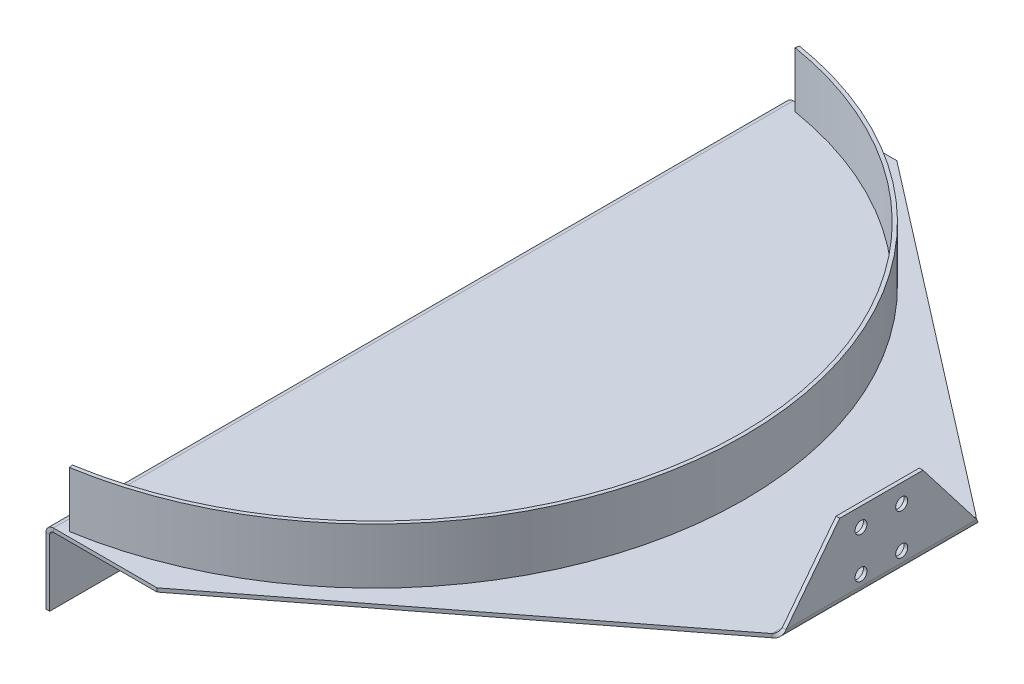
ISO-10303-21;
HEADER;
FILE_DESCRIPTION(('STEP AP214'),'2;1');
FILE_NAME('part.step','',(''),(''),'','','');
FILE_SCHEMA(('AUTOMOTIVE_DESIGN { 1 0 10303 214 1 1 1 1 }'));
ENDSEC;
DATA;
#1=APPLICATION_CONTEXT('core data for automotive mechanical design processes');
#2=APPLICATION_PROTOCOL_DEFINITION('international standard','automotive_design',2000,#1);
#3=PRODUCT_CONTEXT('',#1,'mechanical');
#4=PRODUCT('Part','Part','',(#3));
#5=PRODUCT_RELATED_PRODUCT_CATEGORY('part','',(#4));
#6=PRODUCT_DEFINITION_FORMATION('','',#4);
#7=PRODUCT_DEFINITION_CONTEXT('part definition',#1,'design');
#8=PRODUCT_DEFINITION('design','',#6,#7);
#9=PRODUCT_DEFINITION_SHAPE('','',#8);
#10=(LENGTH_UNIT() NAMED_UNIT(*) SI_UNIT(.MILLI.,.METRE.));
#11=(NAMED_UNIT(*) PLANE_ANGLE_UNIT() SI_UNIT($,.RADIAN.));
#12=(NAMED_UNIT(*) SI_UNIT($,.STERADIAN.) SOLID_ANGLE_UNIT());
#13=UNCERTAINTY_MEASURE_WITH_UNIT(LENGTH_MEASURE(1.E-05),#10,'distance_accuracy_value','');
#14=(GEOMETRIC_REPRESENTATION_CONTEXT(3) GLOBAL_UNCERTAINTY_ASSIGNED_CONTEXT((#13)) GLOBAL_UNIT_ASSIGNED_CONTEXT((#10,
#11,#12)) REPRESENTATION_CONTEXT('',''));
#15=CARTESIAN_POINT('',(0.,0.,0.));
#16=DIRECTION('',(0.,0.,1.));
#17=DIRECTION('',(1.,0.,0.));
#18=AXIS2_PLACEMENT_3D('',#15,#16,#17);
#19=CARTESIAN_POINT('',(0.,0.,200.));
#20=DIRECTION('',(0.,1.,0.));
#21=DIRECTION('',(0.,0.,1.));
#22=AXIS2_PLACEMENT_3D('',#19,#20,#21);
#23=PLANE('',#22);
#24=DIRECTION('',(0.,0.,1.));
#25=VECTOR('',#24,1.);
#26=CARTESIAN_POINT('',(247.643805509807,0.,200.));
#27=LINE('',#26,#25);
#28=CARTESIAN_POINT('',(247.643805509807,0.,-55.1879327043874));
#29=VERTEX_POINT('',#28);
#30=CARTESIAN_POINT('',(247.643805509807,0.,55.1879327043878));
#31=VERTEX_POINT('',#30);
#32=EDGE_CURVE('E415',#29,#31,#27,.T.);
#33=ORIENTED_EDGE('',*,*,#32,.F.);
#34=DIRECTION('',(0.791663337808105,0.,0.610957575917125));
#35=VECTOR('',#34,1.);
#36=CARTESIAN_POINT('',(60.,0.,-200.));
#37=LINE('',#36,#35);
#38=CARTESIAN_POINT('',(60.,0.,-200.));
#39=VERTEX_POINT('',#38);
#40=EDGE_CURVE('E369',#39,#29,#37,.T.);
#41=ORIENTED_EDGE('',*,*,#40,.F.);
#42=DIRECTION('',(1.,0.,0.));
#43=VECTOR('',#42,1.);
#44=CARTESIAN_POINT('',(0.,0.,-200.));
#45=LINE('',#44,#43);
#46=CARTESIAN_POINT('',(4.,0.,-200.));
#47=VERTEX_POINT('',#46);
#48=EDGE_CURVE('E365',#47,#39,#45,.T.);
#49=ORIENTED_EDGE('',*,*,#48,.F.);
#50=DIRECTION('',(0.,0.,-1.));
#51=VECTOR('',#50,1.);
#52=CARTESIAN_POINT('',(4.,0.,-200.));
#53=LINE('',#52,#51);
#54=CARTESIAN_POINT('',(4.,0.,200.));
#55=VERTEX_POINT('',#54);
#56=EDGE_CURVE('E368',#55,#47,#53,.T.);
#57=ORIENTED_EDGE('',*,*,#56,.F.);
#58=DIRECTION('',(-1.,0.,0.));
#59=VECTOR('',#58,1.);
#60=CARTESIAN_POINT('',(0.,0.,200.));
#61=LINE('',#60,#59);
#62=CARTESIAN_POINT('',(59.9999999999999,0.,200.));
#63=VERTEX_POINT('',#62);
#64=EDGE_CURVE('E394',#63,#55,#61,.T.);
#65=ORIENTED_EDGE('',*,*,#64,.F.);
#66=DIRECTION('',(-0.791663337808105,0.,0.610957575917125));
#67=VECTOR('',#66,1.);
#68=CARTESIAN_POINT('',(59.9999999999999,0.,200.));
#69=LINE('',#68,#67);
#70=EDGE_CURVE('E364',#31,#63,#69,.T.);
#71=ORIENTED_EDGE('',*,*,#70,.F.);
#72=EDGE_LOOP('',(#33,#41,#49,#57,#65,#71));
#73=FACE_BOUND('',#72,.T.);
#74=DIRECTION('',(-0.162499999999995,0.,-0.986708543593295));
#75=VECTOR('',#74,1.);
#76=CARTESIAN_POINT('',(9.99999999999998,0.,197.341708718659));
#77=LINE('',#76,#75);
#78=CARTESIAN_POINT('',(9.99999999999998,0.,197.341708718659));
#79=VERTEX_POINT('',#78);
#80=CARTESIAN_POINT('',(9.67499999999999,0.,195.368291631472));
#81=VERTEX_POINT('',#80);
#82=EDGE_CURVE('E51',#79,#81,#77,.T.);
#83=ORIENTED_EDGE('',*,*,#82,.T.);
#84=CARTESIAN_POINT('',(-22.5,0.,0.));
#85=DIRECTION('',(0.,1.,0.));
#86=DIRECTION('',(-1.,0.,0.));
#87=AXIS2_PLACEMENT_3D('',#84,#85,#86);
#88=CIRCLE('',#87,198.);
#89=CARTESIAN_POINT('',(9.67500000000008,0.,-195.368291631472));
#90=VERTEX_POINT('',#89);
#91=EDGE_CURVE('E158',#90,#81,#88,.F.);
#92=ORIENTED_EDGE('',*,*,#91,.F.);
#93=DIRECTION('',(0.162499999999955,0.,-0.986708543593302));
#94=VECTOR('',#93,1.);
#95=CARTESIAN_POINT('',(9.67500000000008,0.,-195.368291631472));
#96=LINE('',#95,#94);
#97=CARTESIAN_POINT('',(9.99999999999999,0.,-197.341708718659));
#98=VERTEX_POINT('',#97);
#99=EDGE_CURVE('E161',#90,#98,#96,.T.);
#100=ORIENTED_EDGE('',*,*,#99,.T.);
#101=CARTESIAN_POINT('',(-22.5,0.,0.));
#102=DIRECTION('',(0.,-1.,0.));
#103=DIRECTION('',(0.,0.,-1.));
#104=AXIS2_PLACEMENT_3D('',#101,#102,#103);
#105=CIRCLE('',#104,200.);
#106=EDGE_CURVE('E56',#98,#79,#105,.T.);
#107=ORIENTED_EDGE('',*,*,#106,.T.);
#108=EDGE_LOOP('',(#83,#92,#100,#107));
#109=FACE_BOUND('',#108,.T.);
#110=ADVANCED_FACE('F33',(#73,#109),#23,.T.);
#111=CARTESIAN_POINT('',(249.643805509808,-250.356194490192,200.));
#112=DIRECTION('',(-1.,0.,0.));
#113=DIRECTION('',(0.,0.,1.));
#114=AXIS2_PLACEMENT_3D('',#111,#112,#113);
#115=PLANE('',#114);
#116=CARTESIAN_POINT('',(249.643805509807,7.64380550980766,-11.0000000000002));
#117=DIRECTION('',(-1.,0.,0.));
#118=DIRECTION('',(0.,-1.,0.));
#119=AXIS2_PLACEMENT_3D('',#116,#117,#118);
#120=CIRCLE('',#119,3.25);
#121=CARTESIAN_POINT('',(249.643805509807,4.39380550980766,-11.0000000000002));
#122=VERTEX_POINT('',#121);
#123=EDGE_CURVE('E769',#122,#122,#120,.F.);
#124=ORIENTED_EDGE('',*,*,#123,.T.);
#125=EDGE_LOOP('',(#124));
#126=FACE_BOUND('',#125,.T.);
#127=CARTESIAN_POINT('',(249.643805509807,7.64380550980766,10.9999999999998));
#128=DIRECTION('',(-1.,0.,0.));
#129=DIRECTION('',(0.,-1.,0.));
#130=AXIS2_PLACEMENT_3D('',#127,#128,#129);
#131=CIRCLE('',#130,3.25);
#132=CARTESIAN_POINT('',(249.643805509807,4.39380550980766,10.9999999999998));
#133=VERTEX_POINT('',#132);
#134=EDGE_CURVE('E777',#133,#133,#131,.F.);
#135=ORIENTED_EDGE('',*,*,#134,.T.);
#136=EDGE_LOOP('',(#135));
#137=FACE_BOUND('',#136,.T.);
#138=CARTESIAN_POINT('',(249.643805509807,29.6438055098077,-11.));
#139=DIRECTION('',(-1.,0.,0.));
#140=DIRECTION('',(0.,-1.,0.));
#141=AXIS2_PLACEMENT_3D('',#138,#139,#140);
#142=CIRCLE('',#141,3.25);
#143=CARTESIAN_POINT('',(249.643805509807,26.3938055098077,-11.));
#144=VERTEX_POINT('',#143);
#145=EDGE_CURVE('E783',#144,#144,#142,.F.);
#146=ORIENTED_EDGE('',*,*,#145,.T.);
#147=EDGE_LOOP('',(#146));
#148=FACE_BOUND('',#147,.T.);
#149=CARTESIAN_POINT('',(249.643805509807,29.6438055098077,11.));
#150=DIRECTION('',(-1.,0.,0.));
#151=DIRECTION('',(0.,-1.,0.));
#152=AXIS2_PLACEMENT_3D('',#149,#150,#151);
#153=CIRCLE('',#152,3.25);
#154=CARTESIAN_POINT('',(249.643805509807,26.3938055098077,11.));
#155=VERTEX_POINT('',#154);
#156=EDGE_CURVE('E789',#155,#155,#153,.F.);
#157=ORIENTED_EDGE('',*,*,#156,.T.);
#158=EDGE_LOOP('',(#157));
#159=FACE_BOUND('',#158,.T.);
#160=DIRECTION('',(0.,0.791663337808105,0.610957575917125));
#161=VECTOR('',#160,1.);
#162=CARTESIAN_POINT('',(249.643805509808,-190.356194490192,-200.));
#163=LINE('',#162,#161);
#164=CARTESIAN_POINT('',(249.643805509807,2.00000000000006,-51.5511977303952));
#165=VERTEX_POINT('',#164);
#166=CARTESIAN_POINT('',(249.643805509807,39.6438055098079,-22.5));
#167=VERTEX_POINT('',#166);
#168=EDGE_CURVE('E480',#165,#167,#163,.T.);
#169=ORIENTED_EDGE('',*,*,#168,.F.);
#170=DIRECTION('',(0.,0.,1.));
#171=VECTOR('',#170,1.);
#172=CARTESIAN_POINT('',(249.643805509807,1.99999999999995,200.));
#173=LINE('',#172,#171);
#174=CARTESIAN_POINT('',(249.643805509807,2.00000000000001,51.5511977303954));
#175=VERTEX_POINT('',#174);
#176=EDGE_CURVE('E11',#165,#175,#173,.T.);
#177=ORIENTED_EDGE('',*,*,#176,.T.);
#178=DIRECTION('',(0.,-0.791663337808105,0.610957575917125));
#179=VECTOR('',#178,1.);
#180=CARTESIAN_POINT('',(249.643805509808,-190.356194490192,200.));
#181=LINE('',#180,#179);
#182=CARTESIAN_POINT('',(249.643805509807,39.6438055098077,22.5));
#183=VERTEX_POINT('',#182);
#184=EDGE_CURVE('E491',#183,#175,#181,.T.);
#185=ORIENTED_EDGE('',*,*,#184,.F.);
#186=DIRECTION('',(0.,0.,-1.));
#187=VECTOR('',#186,1.);
#188=CARTESIAN_POINT('',(249.643805509807,39.6438055098079,200.));
#189=LINE('',#188,#187);
#190=EDGE_CURVE('E486',#183,#167,#189,.T.);
#191=ORIENTED_EDGE('',*,*,#190,.T.);
#192=EDGE_LOOP('',(#169,#177,#185,#191));
#193=FACE_BOUND('',#192,.T.);
#194=ADVANCED_FACE('F437',(#126,#137,#148,#159,#193),#115,.T.);
#195=CARTESIAN_POINT('',(1235.09893920936,-190.356194490189,-200.));
#196=DIRECTION('',(0.,-0.610957575917125,0.791663337808105));
#197=DIRECTION('',(0.,-0.791663337808106,-0.610957575917125));
#198=AXIS2_PLACEMENT_3D('',#195,#196,#197);
#199=PLANE('',#198);
#200=CARTESIAN_POINT('',(249.643805509807,2.00000000000004,-51.551197730395));
#201=CARTESIAN_POINT('',(251.643805509807,2.00000000000007,-51.5511977303951));
#202=B_SPLINE_CURVE_WITH_KNOTS('',1,(#200,#201),.UNSPECIFIED.,.F.,.F.,(2,2),(0.,1.),.UNSPECIFIED.);
#203=CARTESIAN_POINT('',(251.643805509807,2.00000000000006,-51.5511977303952));
#204=VERTEX_POINT('',#203);
#205=EDGE_CURVE('E312',#165,#204,#202,.T.);
#206=ORIENTED_EDGE('',*,*,#205,.F.);
#207=ORIENTED_EDGE('',*,*,#168,.T.);
#208=DIRECTION('',(-1.,0.,0.));
#209=VECTOR('',#208,1.);
#210=CARTESIAN_POINT('',(1235.09893920936,39.6438055098113,-22.5));
#211=LINE('',#210,#209);
#212=CARTESIAN_POINT('',(251.643805509807,39.6438055098079,-22.5));
#213=VERTEX_POINT('',#212);
#214=EDGE_CURVE('E503',#213,#167,#211,.T.);
#215=ORIENTED_EDGE('',*,*,#214,.F.);
#216=DIRECTION('',(0.,0.791663337808105,0.610957575917125));
#217=VECTOR('',#216,1.);
#218=CARTESIAN_POINT('',(251.643805509808,-190.356194490192,-200.));
#219=LINE('',#218,#217);
#220=EDGE_CURVE('E466',#204,#213,#219,.T.);
#221=ORIENTED_EDGE('',*,*,#220,.F.);
#222=EDGE_LOOP('',(#206,#207,#215,#221));
#223=FACE_BOUND('',#222,.T.);
#224=ADVANCED_FACE('F35',(#223),#199,.F.);
#225=CARTESIAN_POINT('',(1235.09893920936,39.6438055098114,200.));
#226=DIRECTION('',(0.,1.,0.));
#227=DIRECTION('',(-1.,0.,0.));
#228=AXIS2_PLACEMENT_3D('',#225,#226,#227);
#229=PLANE('',#228);
#230=ORIENTED_EDGE('',*,*,#214,.T.);
#231=ORIENTED_EDGE('',*,*,#190,.F.);
#232=DIRECTION('',(-1.,0.,0.));
#233=VECTOR('',#232,1.);
#234=CARTESIAN_POINT('',(1235.09893920936,39.6438055098111,22.5));
#235=LINE('',#234,#233);
#236=CARTESIAN_POINT('',(251.643805509807,39.6438055098077,22.5));
#237=VERTEX_POINT('',#236);
#238=EDGE_CURVE('E471',#237,#183,#235,.T.);
#239=ORIENTED_EDGE('',*,*,#238,.F.);
#240=DIRECTION('',(0.,0.,-1.));
#241=VECTOR('',#240,1.);
#242=CARTESIAN_POINT('',(251.643805509807,39.6438055098079,200.));
#243=LINE('',#242,#241);
#244=EDGE_CURVE('E467',#237,#213,#243,.T.);
#245=ORIENTED_EDGE('',*,*,#244,.T.);
#246=EDGE_LOOP('',(#230,#231,#239,#245));
#247=FACE_BOUND('',#246,.T.);
#248=ADVANCED_FACE('F447',(#247),#229,.T.);
#249=CARTESIAN_POINT('',(1235.09893920936,-190.356194490189,200.));
#250=DIRECTION('',(0.,-0.610957575917125,-0.791663337808105));
#251=DIRECTION('',(0.,0.791663337808105,-0.610957575917125));
#252=AXIS2_PLACEMENT_3D('',#249,#250,#251);
#253=PLANE('',#252);
#254=CARTESIAN_POINT('',(251.643805509807,2.,51.5511977303952));
#255=CARTESIAN_POINT('',(249.643805509807,2.00000000000001,51.5511977303953));
#256=B_SPLINE_CURVE_WITH_KNOTS('',1,(#254,#255),.UNSPECIFIED.,.F.,.F.,(2,2),(0.,1.),.UNSPECIFIED.);
#257=CARTESIAN_POINT('',(251.643805509807,2.,51.5511977303951));
#258=VERTEX_POINT('',#257);
#259=EDGE_CURVE('E299',#258,#175,#256,.T.);
#260=ORIENTED_EDGE('',*,*,#259,.F.);
#261=DIRECTION('',(0.,-0.791663337808105,0.610957575917125));
#262=VECTOR('',#261,1.);
#263=CARTESIAN_POINT('',(251.643805509808,-190.356194490192,200.));
#264=LINE('',#263,#262);
#265=EDGE_CURVE('E463',#237,#258,#264,.T.);
#266=ORIENTED_EDGE('',*,*,#265,.F.);
#267=ORIENTED_EDGE('',*,*,#238,.T.);
#268=ORIENTED_EDGE('',*,*,#184,.T.);
#269=EDGE_LOOP('',(#260,#266,#267,#268));
#270=FACE_BOUND('',#269,.T.);
#271=ADVANCED_FACE('F443',(#270),#253,.F.);
#272=CARTESIAN_POINT('',(251.643805509808,-250.356194490192,200.));
#273=DIRECTION('',(-1.,0.,0.));
#274=DIRECTION('',(0.,0.,1.));
#275=AXIS2_PLACEMENT_3D('',#272,#273,#274);
#276=PLANE('',#275);
#277=CARTESIAN_POINT('',(251.643805509807,7.64380550980767,-11.0000000000002));
#278=DIRECTION('',(1.,0.,0.));
#279=DIRECTION('',(0.,1.,0.));
#280=AXIS2_PLACEMENT_3D('',#277,#278,#279);
#281=CIRCLE('',#280,3.25);
#282=CARTESIAN_POINT('',(251.643805509807,10.8938055098077,-11.0000000000002));
#283=VERTEX_POINT('',#282);
#284=EDGE_CURVE('E774',#283,#283,#281,.T.);
#285=ORIENTED_EDGE('',*,*,#284,.F.);
#286=EDGE_LOOP('',(#285));
#287=FACE_BOUND('',#286,.T.);
#288=CARTESIAN_POINT('',(251.643805509807,7.64380550980767,10.9999999999998));
#289=DIRECTION('',(1.,0.,0.));
#290=DIRECTION('',(0.,1.,0.));
#291=AXIS2_PLACEMENT_3D('',#288,#289,#290);
#292=CIRCLE('',#291,3.25);
#293=CARTESIAN_POINT('',(251.643805509807,10.8938055098077,10.9999999999998));
#294=VERTEX_POINT('',#293);
#295=EDGE_CURVE('E780',#294,#294,#292,.T.);
#296=ORIENTED_EDGE('',*,*,#295,.F.);
#297=EDGE_LOOP('',(#296));
#298=FACE_BOUND('',#297,.T.);
#299=CARTESIAN_POINT('',(251.643805509807,29.6438055098077,-11.));
#300=DIRECTION('',(1.,0.,0.));
#301=DIRECTION('',(0.,1.,0.));
#302=AXIS2_PLACEMENT_3D('',#299,#300,#301);
#303=CIRCLE('',#302,3.25);
#304=CARTESIAN_POINT('',(251.643805509807,32.8938055098077,-11.));
#305=VERTEX_POINT('',#304);
#306=EDGE_CURVE('E786',#305,#305,#303,.T.);
#307=ORIENTED_EDGE('',*,*,#306,.F.);
#308=EDGE_LOOP('',(#307));
#309=FACE_BOUND('',#308,.T.);
#310=CARTESIAN_POINT('',(251.643805509807,29.6438055098077,11.));
#311=DIRECTION('',(1.,0.,0.));
#312=DIRECTION('',(0.,1.,0.));
#313=AXIS2_PLACEMENT_3D('',#310,#311,#312);
#314=CIRCLE('',#313,3.25);
#315=CARTESIAN_POINT('',(251.643805509807,32.8938055098077,11.));
#316=VERTEX_POINT('',#315);
#317=EDGE_CURVE('E165',#316,#316,#314,.T.);
#318=ORIENTED_EDGE('',*,*,#317,.F.);
#319=EDGE_LOOP('',(#318));
#320=FACE_BOUND('',#319,.T.);
#321=DIRECTION('',(0.,0.,1.));
#322=VECTOR('',#321,1.);
#323=CARTESIAN_POINT('',(251.643805509807,1.99999999999995,200.));
#324=LINE('',#323,#322);
#325=EDGE_CURVE('E43',#204,#258,#324,.T.);
#326=ORIENTED_EDGE('',*,*,#325,.F.);
#327=ORIENTED_EDGE('',*,*,#220,.T.);
#328=ORIENTED_EDGE('',*,*,#244,.F.);
#329=ORIENTED_EDGE('',*,*,#265,.T.);
#330=EDGE_LOOP('',(#326,#327,#328,#329));
#331=FACE_BOUND('',#330,.T.);
#332=ADVANCED_FACE('F428',(#287,#298,#309,#320,#331),#276,.F.);
#333=CARTESIAN_POINT('',(60.,-985.45513369955,-200.));
#334=DIRECTION('',(-0.610957575917125,0.,0.791663337808105));
#335=DIRECTION('',(-0.791663337808106,0.,-0.610957575917125));
#336=AXIS2_PLACEMENT_3D('',#333,#334,#335);
#337=PLANE('',#336);
#338=ORIENTED_EDGE('',*,*,#40,.T.);
#339=CARTESIAN_POINT('',(247.643805509807,-1.99999999999998,-55.1879327043877));
#340=CARTESIAN_POINT('',(247.643805509807,0.,-55.1879327043875));
#341=B_SPLINE_CURVE_WITH_KNOTS('',1,(#339,#340),.UNSPECIFIED.,.F.,.F.,(2,2),(0.,1.),.UNSPECIFIED.);
#342=CARTESIAN_POINT('',(247.643805509807,-2.,-55.1879327043878));
#343=VERTEX_POINT('',#342);
#344=EDGE_CURVE('E410',#29,#343,#341,.F.);
#345=ORIENTED_EDGE('',*,*,#344,.T.);
#346=DIRECTION('',(0.791663337808105,0.,0.610957575917125));
#347=VECTOR('',#346,1.);
#348=CARTESIAN_POINT('',(60.,-2.,-200.));
#349=LINE('',#348,#347);
#350=CARTESIAN_POINT('',(60.,-2.00000000000022,-200.));
#351=VERTEX_POINT('',#350);
#352=EDGE_CURVE('E376',#351,#343,#349,.T.);
#353=ORIENTED_EDGE('',*,*,#352,.F.);
#354=DIRECTION('',(0.,1.,0.));
#355=VECTOR('',#354,1.);
#356=CARTESIAN_POINT('',(60.,-985.45513369955,-200.));
#357=LINE('',#356,#355);
#358=EDGE_CURVE('E385',#351,#39,#357,.T.);
#359=ORIENTED_EDGE('',*,*,#358,.T.);
#360=EDGE_LOOP('',(#338,#345,#353,#359));
#361=FACE_BOUND('',#360,.T.);
#362=ADVANCED_FACE('F417',(#361),#337,.F.);
#363=CARTESIAN_POINT('',(60.,-985.45513369955,200.));
#364=DIRECTION('',(-0.610957575917125,0.,-0.791663337808105));
#365=DIRECTION('',(0.791663337808105,0.,-0.610957575917125));
#366=AXIS2_PLACEMENT_3D('',#363,#364,#365);
#367=PLANE('',#366);
#368=DIRECTION('',(-0.791663337808105,0.,0.610957575917125));
#369=VECTOR('',#368,1.);
#370=CARTESIAN_POINT('',(59.9999999999999,-2.,200.));
#371=LINE('',#370,#369);
#372=CARTESIAN_POINT('',(247.643805509807,-1.99999999999998,55.1879327043878));
#373=VERTEX_POINT('',#372);
#374=CARTESIAN_POINT('',(60.,-2.00000000000022,200.));
#375=VERTEX_POINT('',#374);
#376=EDGE_CURVE('E372',#373,#375,#371,.T.);
#377=ORIENTED_EDGE('',*,*,#376,.F.);
#378=CARTESIAN_POINT('',(247.643805509807,0.,55.1879327043878));
#379=CARTESIAN_POINT('',(247.643805509807,-1.99999999999998,55.1879327043877));
#380=B_SPLINE_CURVE_WITH_KNOTS('',1,(#378,#379),.UNSPECIFIED.,.F.,.F.,(2,2),(0.,1.),.UNSPECIFIED.);
#381=EDGE_CURVE('E399',#373,#31,#380,.F.);
#382=ORIENTED_EDGE('',*,*,#381,.T.);
#383=ORIENTED_EDGE('',*,*,#70,.T.);
#384=DIRECTION('',(0.,1.,0.));
#385=VECTOR('',#384,1.);
#386=CARTESIAN_POINT('',(60.,-985.45513369955,200.));
#387=LINE('',#386,#385);
#388=EDGE_CURVE('E382',#375,#63,#387,.T.);
#389=ORIENTED_EDGE('',*,*,#388,.F.);
#390=EDGE_LOOP('',(#377,#382,#383,#389));
#391=FACE_BOUND('',#390,.T.);
#392=ADVANCED_FACE('F427',(#391),#367,.F.);
#393=CARTESIAN_POINT('',(0.,-2.,200.));
#394=DIRECTION('',(0.,1.,0.));
#395=DIRECTION('',(0.,0.,1.));
#396=AXIS2_PLACEMENT_3D('',#393,#394,#395);
#397=PLANE('',#396);
#398=ORIENTED_EDGE('',*,*,#352,.T.);
#399=DIRECTION('',(0.,0.,1.));
#400=VECTOR('',#399,1.);
#401=CARTESIAN_POINT('',(247.643805509807,-2.,200.));
#402=LINE('',#401,#400);
#403=EDGE_CURVE('E397',#343,#373,#402,.T.);
#404=ORIENTED_EDGE('',*,*,#403,.T.);
#405=ORIENTED_EDGE('',*,*,#376,.T.);
#406=DIRECTION('',(-1.,0.,0.));
#407=VECTOR('',#406,1.);
#408=CARTESIAN_POINT('',(0.,-2.,200.));
#409=LINE('',#408,#407);
#410=CARTESIAN_POINT('',(4.,-2.,200.));
#411=VERTEX_POINT('',#410);
#412=EDGE_CURVE('E391',#375,#411,#409,.T.);
#413=ORIENTED_EDGE('',*,*,#412,.T.);
#414=DIRECTION('',(0.,0.,-1.));
#415=VECTOR('',#414,1.);
#416=CARTESIAN_POINT('',(4.,-2.,-200.));
#417=LINE('',#416,#415);
#418=CARTESIAN_POINT('',(4.,-2.,-200.));
#419=VERTEX_POINT('',#418);
#420=EDGE_CURVE('E377',#411,#419,#417,.T.);
#421=ORIENTED_EDGE('',*,*,#420,.T.);
#422=DIRECTION('',(1.,0.,0.));
#423=VECTOR('',#422,1.);
#424=CARTESIAN_POINT('',(0.,-2.,-200.));
#425=LINE('',#424,#423);
#426=EDGE_CURVE('E373',#419,#351,#425,.T.);
#427=ORIENTED_EDGE('',*,*,#426,.T.);
#428=EDGE_LOOP('',(#398,#404,#405,#413,#421,#427));
#429=FACE_BOUND('',#428,.T.);
#430=ADVANCED_FACE('F435',(#429),#397,.F.);
#431=CARTESIAN_POINT('',(0.,-985.45513369955,-200.));
#432=DIRECTION('',(0.,0.,1.));
#433=DIRECTION('',(0.,-1.,0.));
#434=AXIS2_PLACEMENT_3D('',#431,#432,#433);
#435=PLANE('',#434);
#436=ORIENTED_EDGE('',*,*,#48,.T.);
#437=ORIENTED_EDGE('',*,*,#358,.F.);
#438=ORIENTED_EDGE('',*,*,#426,.F.);
#439=DIRECTION('',(0.,1.,0.));
#440=VECTOR('',#439,1.);
#441=CARTESIAN_POINT('',(4.,-985.45513369955,-200.));
#442=LINE('',#441,#440);
#443=EDGE_CURVE('E388',#419,#47,#442,.T.);
#444=ORIENTED_EDGE('',*,*,#443,.T.);
#445=EDGE_LOOP('',(#436,#437,#438,#444));
#446=FACE_BOUND('',#445,.T.);
#447=ADVANCED_FACE('F431',(#446),#435,.F.);
#448=CARTESIAN_POINT('',(0.,-985.45513369955,200.));
#449=DIRECTION('',(0.,0.,1.));
#450=DIRECTION('',(0.,-1.,0.));
#451=AXIS2_PLACEMENT_3D('',#448,#449,#450);
#452=PLANE('',#451);
#453=ORIENTED_EDGE('',*,*,#388,.T.);
#454=ORIENTED_EDGE('',*,*,#64,.T.);
#455=DIRECTION('',(0.,1.,0.));
#456=VECTOR('',#455,1.);
#457=CARTESIAN_POINT('',(4.,-985.45513369955,200.));
#458=LINE('',#457,#456);
#459=EDGE_CURVE('E380',#411,#55,#458,.T.);
#460=ORIENTED_EDGE('',*,*,#459,.F.);
#461=ORIENTED_EDGE('',*,*,#412,.F.);
#462=EDGE_LOOP('',(#453,#454,#460,#461));
#463=FACE_BOUND('',#462,.T.);
#464=ADVANCED_FACE('F434',(#463),#452,.T.);
#465=CARTESIAN_POINT('',(805.233465438287,-40.,-200.));
#466=DIRECTION('',(0.,0.,1.));
#467=DIRECTION('',(1.,0.,0.));
#468=AXIS2_PLACEMENT_3D('',#465,#466,#467);
#469=PLANE('',#468);
#470=DIRECTION('',(0.,1.,0.));
#471=VECTOR('',#470,1.);
#472=CARTESIAN_POINT('',(0.,-40.,-200.));
#473=LINE('',#472,#471);
#474=CARTESIAN_POINT('',(0.,-40.,-200.));
#475=VERTEX_POINT('',#474);
#476=CARTESIAN_POINT('',(0.,-4.,-200.));
#477=VERTEX_POINT('',#476);
#478=EDGE_CURVE('E332',#475,#477,#473,.T.);
#479=ORIENTED_EDGE('',*,*,#478,.T.);
#480=DIRECTION('',(-1.,0.,0.));
#481=VECTOR('',#480,1.);
#482=CARTESIAN_POINT('',(805.233465438287,-4.,-200.));
#483=LINE('',#482,#481);
#484=CARTESIAN_POINT('',(2.,-4.,-200.));
#485=VERTEX_POINT('',#484);
#486=EDGE_CURVE('E362',#485,#477,#483,.T.);
#487=ORIENTED_EDGE('',*,*,#486,.F.);
#488=DIRECTION('',(0.,1.,0.));
#489=VECTOR('',#488,1.);
#490=CARTESIAN_POINT('',(2.,-40.,-200.));
#491=LINE('',#490,#489);
#492=CARTESIAN_POINT('',(2.,-40.,-200.));
#493=VERTEX_POINT('',#492);
#494=EDGE_CURVE('E343',#493,#485,#491,.T.);
#495=ORIENTED_EDGE('',*,*,#494,.F.);
#496=DIRECTION('',(-1.,0.,0.));
#497=VECTOR('',#496,1.);
#498=CARTESIAN_POINT('',(805.233465438287,-40.,-200.));
#499=LINE('',#498,#497);
#500=EDGE_CURVE('E354',#493,#475,#499,.T.);
#501=ORIENTED_EDGE('',*,*,#500,.T.);
#502=EDGE_LOOP('',(#479,#487,#495,#501));
#503=FACE_BOUND('',#502,.T.);
#504=ADVANCED_FACE('F529',(#503),#469,.F.);
#505=CARTESIAN_POINT('',(805.233465438287,-40.,200.));
#506=DIRECTION('',(0.,0.,1.));
#507=DIRECTION('',(1.,0.,0.));
#508=AXIS2_PLACEMENT_3D('',#505,#506,#507);
#509=PLANE('',#508);
#510=DIRECTION('',(-1.,0.,0.));
#511=VECTOR('',#510,1.);
#512=CARTESIAN_POINT('',(805.233465438287,-4.,200.));
#513=LINE('',#512,#511);
#514=CARTESIAN_POINT('',(2.,-4.,200.));
#515=VERTEX_POINT('',#514);
#516=CARTESIAN_POINT('',(0.,-4.,200.));
#517=VERTEX_POINT('',#516);
#518=EDGE_CURVE('E359',#515,#517,#513,.T.);
#519=ORIENTED_EDGE('',*,*,#518,.T.);
#520=DIRECTION('',(0.,1.,0.));
#521=VECTOR('',#520,1.);
#522=CARTESIAN_POINT('',(0.,-40.,200.));
#523=LINE('',#522,#521);
#524=CARTESIAN_POINT('',(0.,-40.,200.));
#525=VERTEX_POINT('',#524);
#526=EDGE_CURVE('E337',#525,#517,#523,.T.);
#527=ORIENTED_EDGE('',*,*,#526,.F.);
#528=DIRECTION('',(-1.,0.,0.));
#529=VECTOR('',#528,1.);
#530=CARTESIAN_POINT('',(805.233465438287,-40.,200.));
#531=LINE('',#530,#529);
#532=CARTESIAN_POINT('',(2.,-40.,200.));
#533=VERTEX_POINT('',#532);
#534=EDGE_CURVE('E357',#533,#525,#531,.T.);
#535=ORIENTED_EDGE('',*,*,#534,.F.);
#536=DIRECTION('',(0.,1.,0.));
#537=VECTOR('',#536,1.);
#538=CARTESIAN_POINT('',(2.,-40.,200.));
#539=LINE('',#538,#537);
#540=EDGE_CURVE('E346',#533,#515,#539,.T.);
#541=ORIENTED_EDGE('',*,*,#540,.T.);
#542=EDGE_LOOP('',(#519,#527,#535,#541));
#543=FACE_BOUND('',#542,.T.);
#544=ADVANCED_FACE('F538',(#543),#509,.T.);
#545=CARTESIAN_POINT('',(805.233465438287,-40.,200.));
#546=DIRECTION('',(0.,1.,0.));
#547=DIRECTION('',(0.,0.,1.));
#548=AXIS2_PLACEMENT_3D('',#545,#546,#547);
#549=PLANE('',#548);
#550=DIRECTION('',(0.,0.,-1.));
#551=VECTOR('',#550,1.);
#552=CARTESIAN_POINT('',(0.,-40.,200.));
#553=LINE('',#552,#551);
#554=EDGE_CURVE('E335',#525,#475,#553,.T.);
#555=ORIENTED_EDGE('',*,*,#554,.T.);
#556=ORIENTED_EDGE('',*,*,#500,.F.);
#557=DIRECTION('',(0.,0.,-1.));
#558=VECTOR('',#557,1.);
#559=CARTESIAN_POINT('',(2.,-40.,200.));
#560=LINE('',#559,#558);
#561=EDGE_CURVE('E349',#533,#493,#560,.T.);
#562=ORIENTED_EDGE('',*,*,#561,.F.);
#563=ORIENTED_EDGE('',*,*,#534,.T.);
#564=EDGE_LOOP('',(#555,#556,#562,#563));
#565=FACE_BOUND('',#564,.T.);
#566=ADVANCED_FACE('F592',(#565),#549,.F.);
#567=CARTESIAN_POINT('',(2.,-40.,200.));
#568=DIRECTION('',(-1.,0.,0.));
#569=DIRECTION('',(0.,0.,1.));
#570=AXIS2_PLACEMENT_3D('',#567,#568,#569);
#571=PLANE('',#570);
#572=CARTESIAN_POINT('',(2.,-20.,-150.));
#573=DIRECTION('',(1.,0.,0.));
#574=DIRECTION('',(0.,0.,-1.));
#575=AXIS2_PLACEMENT_3D('',#572,#573,#574);
#576=CIRCLE('',#575,3.25000000000001);
#577=CARTESIAN_POINT('',(2.,-20.,-153.25));
#578=VERTEX_POINT('',#577);
#579=EDGE_CURVE('E755',#578,#578,#576,.T.);
#580=ORIENTED_EDGE('',*,*,#579,.F.);
#581=EDGE_LOOP('',(#580));
#582=FACE_BOUND('',#581,.T.);
#583=CARTESIAN_POINT('',(2.,-20.,0.));
#584=DIRECTION('',(1.,0.,0.));
#585=DIRECTION('',(0.,0.,-1.));
#586=AXIS2_PLACEMENT_3D('',#583,#584,#585);
#587=CIRCLE('',#586,3.25);
#588=CARTESIAN_POINT('',(2.,-20.,-3.25));
#589=VERTEX_POINT('',#588);
#590=EDGE_CURVE('E759',#589,#589,#587,.T.);
#591=ORIENTED_EDGE('',*,*,#590,.F.);
#592=EDGE_LOOP('',(#591));
#593=FACE_BOUND('',#592,.T.);
#594=CARTESIAN_POINT('',(2.,-20.,150.));
#595=DIRECTION('',(1.,0.,0.));
#596=DIRECTION('',(0.,0.,-1.));
#597=AXIS2_PLACEMENT_3D('',#594,#595,#596);
#598=CIRCLE('',#597,3.25000000000001);
#599=CARTESIAN_POINT('',(2.,-20.,146.75));
#600=VERTEX_POINT('',#599);
#601=EDGE_CURVE('E766',#600,#600,#598,.T.);
#602=ORIENTED_EDGE('',*,*,#601,.F.);
#603=EDGE_LOOP('',(#602));
#604=FACE_BOUND('',#603,.T.);
#605=DIRECTION('',(0.,0.,-1.));
#606=VECTOR('',#605,1.);
#607=CARTESIAN_POINT('',(2.,-4.,-200.));
#608=LINE('',#607,#606);
#609=EDGE_CURVE('E351',#515,#485,#608,.T.);
#610=ORIENTED_EDGE('',*,*,#609,.F.);
#611=ORIENTED_EDGE('',*,*,#540,.F.);
#612=ORIENTED_EDGE('',*,*,#561,.T.);
#613=ORIENTED_EDGE('',*,*,#494,.T.);
#614=EDGE_LOOP('',(#610,#611,#612,#613));
#615=FACE_BOUND('',#614,.T.);
#616=ADVANCED_FACE('F581',(#582,#593,#604,#615),#571,.F.);
#617=CARTESIAN_POINT('',(0.,-40.,200.));
#618=DIRECTION('',(-1.,0.,0.));
#619=DIRECTION('',(0.,0.,1.));
#620=AXIS2_PLACEMENT_3D('',#617,#618,#619);
#621=PLANE('',#620);
#622=CARTESIAN_POINT('',(0.,-20.,-150.));
#623=DIRECTION('',(-1.,0.,0.));
#624=DIRECTION('',(0.,0.,1.));
#625=AXIS2_PLACEMENT_3D('',#622,#623,#624);
#626=CIRCLE('',#625,3.25000000000001);
#627=CARTESIAN_POINT('',(0.,-20.,-146.75));
#628=VERTEX_POINT('',#627);
#629=EDGE_CURVE('E752',#628,#628,#626,.F.);
#630=ORIENTED_EDGE('',*,*,#629,.T.);
#631=EDGE_LOOP('',(#630));
#632=FACE_BOUND('',#631,.T.);
#633=CARTESIAN_POINT('',(0.,-20.,0.));
#634=DIRECTION('',(-1.,0.,0.));
#635=DIRECTION('',(0.,0.,1.));
#636=AXIS2_PLACEMENT_3D('',#633,#634,#635);
#637=CIRCLE('',#636,3.25);
#638=CARTESIAN_POINT('',(0.,-20.,3.25));
#639=VERTEX_POINT('',#638);
#640=EDGE_CURVE('E756',#639,#639,#637,.F.);
#641=ORIENTED_EDGE('',*,*,#640,.T.);
#642=EDGE_LOOP('',(#641));
#643=FACE_BOUND('',#642,.T.);
#644=CARTESIAN_POINT('',(0.,-20.,150.));
#645=DIRECTION('',(-1.,0.,0.));
#646=DIRECTION('',(0.,0.,1.));
#647=AXIS2_PLACEMENT_3D('',#644,#645,#646);
#648=CIRCLE('',#647,3.25000000000001);
#649=CARTESIAN_POINT('',(0.,-20.,153.25));
#650=VERTEX_POINT('',#649);
#651=EDGE_CURVE('E764',#650,#650,#648,.F.);
#652=ORIENTED_EDGE('',*,*,#651,.T.);
#653=EDGE_LOOP('',(#652));
#654=FACE_BOUND('',#653,.T.);
#655=ORIENTED_EDGE('',*,*,#526,.T.);
#656=DIRECTION('',(0.,0.,-1.));
#657=VECTOR('',#656,1.);
#658=CARTESIAN_POINT('',(0.,-4.,-200.));
#659=LINE('',#658,#657);
#660=EDGE_CURVE('E340',#517,#477,#659,.T.);
#661=ORIENTED_EDGE('',*,*,#660,.T.);
#662=ORIENTED_EDGE('',*,*,#478,.F.);
#663=ORIENTED_EDGE('',*,*,#554,.F.);
#664=EDGE_LOOP('',(#655,#661,#662,#663));
#665=FACE_BOUND('',#664,.T.);
#666=ADVANCED_FACE('F587',(#632,#643,#654,#665),#621,.T.);
#667=CARTESIAN_POINT('',(4.,-4.,-200.));
#668=DIRECTION('',(0.,0.,-1.));
#669=DIRECTION('',(-1.,0.,0.));
#670=AXIS2_PLACEMENT_3D('',#667,#668,#669);
#671=PLANE('',#670);
#672=ORIENTED_EDGE('',*,*,#443,.F.);
#673=CARTESIAN_POINT('',(4.,-4.,-200.));
#674=DIRECTION('',(0.,0.,1.));
#675=DIRECTION('',(1.,0.,0.));
#676=AXIS2_PLACEMENT_3D('',#673,#674,#675);
#677=CIRCLE('',#676,2.);
#678=EDGE_CURVE('E316',#419,#485,#677,.T.);
#679=ORIENTED_EDGE('',*,*,#678,.T.);
#680=ORIENTED_EDGE('',*,*,#486,.T.);
#681=CARTESIAN_POINT('',(4.,-4.,-200.));
#682=DIRECTION('',(0.,0.,1.));
#683=DIRECTION('',(1.,0.,0.));
#684=AXIS2_PLACEMENT_3D('',#681,#682,#683);
#685=CIRCLE('',#684,4.);
#686=EDGE_CURVE('E326',#47,#477,#685,.T.);
#687=ORIENTED_EDGE('',*,*,#686,.F.);
#688=EDGE_LOOP('',(#672,#679,#680,#687));
#689=FACE_BOUND('',#688,.T.);
#690=ADVANCED_FACE('F575',(#689),#671,.T.);
#691=CARTESIAN_POINT('',(4.,-4.,200.));
#692=DIRECTION('',(0.,0.,1.));
#693=DIRECTION('',(1.,0.,0.));
#694=AXIS2_PLACEMENT_3D('',#691,#692,#693);
#695=PLANE('',#694);
#696=CARTESIAN_POINT('',(4.,-4.,200.));
#697=DIRECTION('',(0.,0.,1.));
#698=DIRECTION('',(1.,0.,0.));
#699=AXIS2_PLACEMENT_3D('',#696,#697,#698);
#700=CIRCLE('',#699,2.);
#701=EDGE_CURVE('E323',#515,#411,#700,.F.);
#702=ORIENTED_EDGE('',*,*,#701,.T.);
#703=ORIENTED_EDGE('',*,*,#459,.T.);
#704=CARTESIAN_POINT('',(4.,-4.,200.));
#705=DIRECTION('',(0.,0.,1.));
#706=DIRECTION('',(1.,0.,0.));
#707=AXIS2_PLACEMENT_3D('',#704,#705,#706);
#708=CIRCLE('',#707,4.);
#709=EDGE_CURVE('E329',#517,#55,#708,.F.);
#710=ORIENTED_EDGE('',*,*,#709,.F.);
#711=ORIENTED_EDGE('',*,*,#518,.F.);
#712=EDGE_LOOP('',(#702,#703,#710,#711));
#713=FACE_BOUND('',#712,.T.);
#714=ADVANCED_FACE('F555',(#713),#695,.T.);
#715=CARTESIAN_POINT('',(4.,-4.,-716.473605437171));
#716=DIRECTION('',(0.,0.,1.));
#717=DIRECTION('',(1.,0.,0.));
#718=AXIS2_PLACEMENT_3D('',#715,#716,#717);
#719=CYLINDRICAL_SURFACE('',#718,4.);
#720=ORIENTED_EDGE('',*,*,#660,.F.);
#721=ORIENTED_EDGE('',*,*,#709,.T.);
#722=ORIENTED_EDGE('',*,*,#56,.T.);
#723=ORIENTED_EDGE('',*,*,#686,.T.);
#724=EDGE_LOOP('',(#720,#721,#722,#723));
#725=FACE_BOUND('',#724,.T.);
#726=ADVANCED_FACE('F553',(#725),#719,.T.);
#727=CARTESIAN_POINT('',(4.,-4.,-716.473605437171));
#728=DIRECTION('',(0.,0.,1.));
#729=DIRECTION('',(1.,0.,0.));
#730=AXIS2_PLACEMENT_3D('',#727,#728,#729);
#731=CYLINDRICAL_SURFACE('',#730,2.);
#732=ORIENTED_EDGE('',*,*,#609,.T.);
#733=ORIENTED_EDGE('',*,*,#678,.F.);
#734=ORIENTED_EDGE('',*,*,#420,.F.);
#735=ORIENTED_EDGE('',*,*,#701,.F.);
#736=EDGE_LOOP('',(#732,#733,#734,#735));
#737=FACE_BOUND('',#736,.T.);
#738=ADVANCED_FACE('F274',(#737),#731,.F.);
#739=CARTESIAN_POINT('',(251.643805509807,2.,51.5511977303952));
#740=CARTESIAN_POINT('',(251.643805509807,1.47633051098594,51.8542999074604));
#741=CARTESIAN_POINT('',(251.539696216481,0.953008462562888,52.1573202260606));
#742=CARTESIAN_POINT('',(251.138951063224,-0.0144759214835783,52.7634427217261));
#743=CARTESIAN_POINT('',(250.8424728794,-0.458186879899642,53.0665039695588));
#744=CARTESIAN_POINT('',(250.101992389707,-1.1986673695927,53.6726264652242));
#745=CARTESIAN_POINT('',(249.658281431291,-1.49514555341701,53.9756877130569));
#746=CARTESIAN_POINT('',(248.690797047244,-1.89589070667324,54.5818102087223));
#747=CARTESIAN_POINT('',(248.167474998821,-1.99999999999998,54.8848305273226));
#748=CARTESIAN_POINT('',(247.643805509807,-1.99999999999998,55.1879327043877));
#749=CARTESIAN_POINT('',(249.643805509807,2.00000000000001,51.5511977303953));
#750=CARTESIAN_POINT('',(249.643805509807,1.73818044102608,51.8542823285553));
#751=CARTESIAN_POINT('',(249.591750863144,1.47650423128145,52.1573202260607));
#752=CARTESIAN_POINT('',(249.391378286516,0.992762039258215,52.7634427217261));
#753=CARTESIAN_POINT('',(249.243139194604,0.77090656005019,53.0665039695588));
#754=CARTESIAN_POINT('',(248.872898949757,0.400666315203662,53.6726264652242));
#755=CARTESIAN_POINT('',(248.651043470549,0.252427223291507,53.975687713057));
#756=CARTESIAN_POINT('',(248.167301278526,0.0520546466633906,54.5818102087224));
#757=CARTESIAN_POINT('',(247.905625068781,0.,54.8848481062278));
#758=CARTESIAN_POINT('',(247.643805509807,0.,55.1879327043878));
#759=B_SPLINE_SURFACE_WITH_KNOTS('',1,3,((#739,#740,#741,#742,#743,#744,#745,#746,#747,#748),
(#749,#750,#751,#752,#753,#754,#755,#756,#757,#758)),.UNSPECIFIED.,.F.,.F.,.F.,(2,2),(4,2,2,2,
4),(0.,1.),(0.,0.25,0.5,0.75,1.),.UNSPECIFIED.);
#760=CARTESIAN_POINT('',(249.643805509807,2.00000000000001,51.5511977303953));
#761=CARTESIAN_POINT('',(249.643805509807,1.73818044102608,51.8542823285553));
#762=CARTESIAN_POINT('',(249.591750863144,1.47650423128145,52.1573202260607));
#763=CARTESIAN_POINT('',(249.391378286516,0.992762039258215,52.7634427217261));
#764=CARTESIAN_POINT('',(249.243139194604,0.77090656005019,53.0665039695588));
#765=CARTESIAN_POINT('',(248.872898949757,0.400666315203662,53.6726264652242));
#766=CARTESIAN_POINT('',(248.651043470549,0.252427223291507,53.975687713057));
#767=CARTESIAN_POINT('',(248.167301278526,0.0520546466633906,54.5818102087224));
#768=CARTESIAN_POINT('',(247.905625068781,0.,54.8848481062278));
#769=CARTESIAN_POINT('',(247.643805509807,0.,55.1879327043878));
#770=B_SPLINE_CURVE_WITH_KNOTS('',3,(#760,#761,#762,#763,#764,#765,#766,#767,#768,#769),
.UNSPECIFIED.,.F.,.F.,(4,2,2,2,4),(0.,0.25,0.5,0.75,1.),.UNSPECIFIED.);
#771=EDGE_CURVE('E247',#175,#31,#770,.T.);
#772=CARTESIAN_POINT('',(247.643805509807,-1.99999999999998,55.1879327043877));
#773=CARTESIAN_POINT('',(248.167474998821,-1.99999999999998,54.8848305273226));
#774=CARTESIAN_POINT('',(248.690797047244,-1.89589070667324,54.5818102087223));
#775=CARTESIAN_POINT('',(249.658281431291,-1.49514555341701,53.9756877130569));
#776=CARTESIAN_POINT('',(250.101992389707,-1.1986673695927,53.6726264652242));
#777=CARTESIAN_POINT('',(250.8424728794,-0.458186879899642,53.0665039695588));
#778=CARTESIAN_POINT('',(251.138951063224,-0.0144759214835783,52.7634427217261));
#779=CARTESIAN_POINT('',(251.539696216481,0.953008462562888,52.1573202260606));
#780=CARTESIAN_POINT('',(251.643805509807,1.47633051098594,51.8542999074604));
#781=CARTESIAN_POINT('',(251.643805509807,2.,51.5511977303952));
#782=B_SPLINE_CURVE_WITH_KNOTS('',3,(#772,#773,#774,#775,#776,#777,#778,#779,#780,#781),
.UNSPECIFIED.,.F.,.F.,(4,2,2,2,4),(0.,0.25,0.5,0.75,1.),.UNSPECIFIED.);
#783=EDGE_CURVE('E240',#258,#373,#782,.F.);
#784=ORIENTED_EDGE('',*,*,#259,.T.);
#785=ORIENTED_EDGE('',*,*,#771,.T.);
#786=ORIENTED_EDGE('',*,*,#381,.F.);
#787=ORIENTED_EDGE('',*,*,#783,.F.);
#788=EDGE_LOOP('',(#784,#785,#786,#787));
#789=FACE_BOUND('',#788,.T.);
#790=ADVANCED_FACE('F263',(#789),#759,.T.);
#791=CARTESIAN_POINT('',(247.643805509807,-1.99999999999998,-55.1879327043877));
#792=CARTESIAN_POINT('',(248.167474998821,-1.99999999999998,-54.8848305273225));
#793=CARTESIAN_POINT('',(248.690797047244,-1.89589070667323,-54.5818102087223));
#794=CARTESIAN_POINT('',(249.658281431291,-1.49514555341699,-53.9756877130568));
#795=CARTESIAN_POINT('',(250.101992389707,-1.19866736959268,-53.6726264652241));
#796=CARTESIAN_POINT('',(250.8424728794,-0.458186879899607,-53.0665039695587));
#797=CARTESIAN_POINT('',(251.138951063224,-0.0144759214835397,-52.763442721726));
#798=CARTESIAN_POINT('',(251.539696216481,0.953008462562944,-52.1573202260606));
#799=CARTESIAN_POINT('',(251.643805509807,1.47633051098598,-51.8542999074604));
#800=CARTESIAN_POINT('',(251.643805509807,2.00000000000007,-51.5511977303951));
#801=CARTESIAN_POINT('',(247.643805509807,0.,-55.1879327043875));
#802=CARTESIAN_POINT('',(247.905625068781,0.,-54.8848481062275));
#803=CARTESIAN_POINT('',(248.167301278526,0.0520546466633905,-54.5818102087221));
#804=CARTESIAN_POINT('',(248.651043470549,0.252427223291511,-53.9756877130567));
#805=CARTESIAN_POINT('',(248.872898949757,0.40066631520367,-53.672626465224));
#806=CARTESIAN_POINT('',(249.243139194604,0.770906560050206,-53.0665039695585));
#807=CARTESIAN_POINT('',(249.391378286516,0.992762039258237,-52.7634427217258));
#808=CARTESIAN_POINT('',(249.591750863144,1.47650423128148,-52.1573202260604));
#809=CARTESIAN_POINT('',(249.643805509807,1.73818044102608,-51.8542823285551));
#810=CARTESIAN_POINT('',(249.643805509807,2.00000000000004,-51.551197730395));
#811=B_SPLINE_SURFACE_WITH_KNOTS('',1,3,((#791,#792,#793,#794,#795,#796,#797,#798,#799,#800),
(#801,#802,#803,#804,#805,#806,#807,#808,#809,#810)),.UNSPECIFIED.,.F.,.F.,.F.,(2,2),(4,2,2,2,
4),(0.,1.),(0.,0.25,0.5,0.75,1.),.UNSPECIFIED.);
#812=CARTESIAN_POINT('',(247.643805509807,0.,-55.1879327043875));
#813=CARTESIAN_POINT('',(247.905625068781,0.,-54.8848481062275));
#814=CARTESIAN_POINT('',(248.167301278526,0.0520546466633905,-54.5818102087221));
#815=CARTESIAN_POINT('',(248.651043470549,0.252427223291511,-53.9756877130567));
#816=CARTESIAN_POINT('',(248.872898949757,0.40066631520367,-53.672626465224));
#817=CARTESIAN_POINT('',(249.243139194604,0.770906560050206,-53.0665039695585));
#818=CARTESIAN_POINT('',(249.391378286516,0.992762039258237,-52.7634427217258));
#819=CARTESIAN_POINT('',(249.591750863144,1.47650423128148,-52.1573202260604));
#820=CARTESIAN_POINT('',(249.643805509807,1.73818044102608,-51.8542823285551));
#821=CARTESIAN_POINT('',(249.643805509807,2.00000000000004,-51.551197730395));
#822=B_SPLINE_CURVE_WITH_KNOTS('',3,(#812,#813,#814,#815,#816,#817,#818,#819,#820,#821),
.UNSPECIFIED.,.F.,.F.,(4,2,2,2,4),(0.,0.25,0.5,0.75,1.),.UNSPECIFIED.);
#823=EDGE_CURVE('E195',#29,#165,#822,.T.);
#824=CARTESIAN_POINT('',(251.643805509807,2.00000000000007,-51.5511977303951));
#825=CARTESIAN_POINT('',(251.643805509807,1.47633051098598,-51.8542999074604));
#826=CARTESIAN_POINT('',(251.539696216481,0.953008462562944,-52.1573202260606));
#827=CARTESIAN_POINT('',(251.138951063224,-0.0144759214835397,-52.763442721726));
#828=CARTESIAN_POINT('',(250.8424728794,-0.458186879899607,-53.0665039695587));
#829=CARTESIAN_POINT('',(250.101992389707,-1.19866736959268,-53.6726264652241));
#830=CARTESIAN_POINT('',(249.658281431291,-1.49514555341699,-53.9756877130568));
#831=CARTESIAN_POINT('',(248.690797047244,-1.89589070667323,-54.5818102087223));
#832=CARTESIAN_POINT('',(248.167474998821,-1.99999999999998,-54.8848305273225));
#833=CARTESIAN_POINT('',(247.643805509807,-1.99999999999998,-55.1879327043877));
#834=B_SPLINE_CURVE_WITH_KNOTS('',3,(#824,#825,#826,#827,#828,#829,#830,#831,#832,#833),
.UNSPECIFIED.,.F.,.F.,(4,2,2,2,4),(0.,0.25,0.5,0.75,1.),.UNSPECIFIED.);
#835=EDGE_CURVE('E511',#343,#204,#834,.F.);
#836=ORIENTED_EDGE('',*,*,#344,.F.);
#837=ORIENTED_EDGE('',*,*,#823,.T.);
#838=ORIENTED_EDGE('',*,*,#205,.T.);
#839=ORIENTED_EDGE('',*,*,#835,.F.);
#840=EDGE_LOOP('',(#836,#837,#838,#839));
#841=FACE_BOUND('',#840,.T.);
#842=ADVANCED_FACE('F213',(#841),#811,.T.);
#843=CARTESIAN_POINT('',(247.643805509807,2.00000000000002,549.050914473141));
#844=DIRECTION('',(0.,0.,-1.));
#845=DIRECTION('',(-1.,0.,0.));
#846=AXIS2_PLACEMENT_3D('',#843,#844,#845);
#847=CYLINDRICAL_SURFACE('',#846,4.);
#848=ORIENTED_EDGE('',*,*,#835,.T.);
#849=ORIENTED_EDGE('',*,*,#325,.T.);
#850=ORIENTED_EDGE('',*,*,#783,.T.);
#851=ORIENTED_EDGE('',*,*,#403,.F.);
#852=EDGE_LOOP('',(#848,#849,#850,#851));
#853=FACE_BOUND('',#852,.T.);
#854=ADVANCED_FACE('F202',(#853),#847,.T.);
#855=CARTESIAN_POINT('',(247.643805509807,2.00000000000002,549.050914473141));
#856=DIRECTION('',(0.,0.,-1.));
#857=DIRECTION('',(-1.,0.,0.));
#858=AXIS2_PLACEMENT_3D('',#855,#856,#857);
#859=CYLINDRICAL_SURFACE('',#858,2.);
#860=ORIENTED_EDGE('',*,*,#823,.F.);
#861=ORIENTED_EDGE('',*,*,#32,.T.);
#862=ORIENTED_EDGE('',*,*,#771,.F.);
#863=ORIENTED_EDGE('',*,*,#176,.F.);
#864=EDGE_LOOP('',(#860,#861,#862,#863));
#865=FACE_BOUND('',#864,.T.);
#866=ADVANCED_FACE('F212',(#865),#859,.F.);
#867=CARTESIAN_POINT('',(-22.5,30.,0.));
#868=DIRECTION('',(0.,-1.,0.));
#869=DIRECTION('',(0.,0.,-1.));
#870=AXIS2_PLACEMENT_3D('',#867,#868,#869);
#871=CYLINDRICAL_SURFACE('',#870,198.);
#872=ORIENTED_EDGE('',*,*,#91,.T.);
#873=DIRECTION('',(0.,-1.,0.));
#874=VECTOR('',#873,1.);
#875=CARTESIAN_POINT('',(9.67499999999999,30.,195.368291631472));
#876=LINE('',#875,#874);
#877=CARTESIAN_POINT('',(9.67499999999999,30.,195.368291631472));
#878=VERTEX_POINT('',#877);
#879=EDGE_CURVE('E193',#878,#81,#876,.T.);
#880=ORIENTED_EDGE('',*,*,#879,.F.);
#881=CARTESIAN_POINT('',(-22.5,30.,0.));
#882=DIRECTION('',(0.,1.,0.));
#883=DIRECTION('',(-1.,0.,0.));
#884=AXIS2_PLACEMENT_3D('',#881,#882,#883);
#885=CIRCLE('',#884,198.);
#886=CARTESIAN_POINT('',(9.67500000000008,30.,-195.368291631472));
#887=VERTEX_POINT('',#886);
#888=EDGE_CURVE('E170',#887,#878,#885,.F.);
#889=ORIENTED_EDGE('',*,*,#888,.F.);
#890=DIRECTION('',(0.,-1.,0.));
#891=VECTOR('',#890,1.);
#892=CARTESIAN_POINT('',(9.67500000000008,30.,-195.368291631472));
#893=LINE('',#892,#891);
#894=EDGE_CURVE('E168',#887,#90,#893,.T.);
#895=ORIENTED_EDGE('',*,*,#894,.T.);
#896=EDGE_LOOP('',(#872,#880,#889,#895));
#897=FACE_BOUND('',#896,.T.);
#898=ADVANCED_FACE('F169',(#897),#871,.F.);
#899=CARTESIAN_POINT('',(9.99999999999998,30.,197.341708718659));
#900=DIRECTION('',(-0.986708543593295,0.,0.162499999999995));
#901=DIRECTION('',(0.162499999999995,0.,0.986708543593295));
#902=AXIS2_PLACEMENT_3D('',#899,#900,#901);
#903=PLANE('',#902);
#904=ORIENTED_EDGE('',*,*,#82,.F.);
#905=DIRECTION('',(0.,-1.,0.));
#906=VECTOR('',#905,1.);
#907=CARTESIAN_POINT('',(9.99999999999998,30.,197.341708718659));
#908=LINE('',#907,#906);
#909=CARTESIAN_POINT('',(9.99999999999998,30.,197.341708718659));
#910=VERTEX_POINT('',#909);
#911=EDGE_CURVE('E191',#910,#79,#908,.T.);
#912=ORIENTED_EDGE('',*,*,#911,.F.);
#913=DIRECTION('',(-0.162499999999995,0.,-0.986708543593295));
#914=VECTOR('',#913,1.);
#915=CARTESIAN_POINT('',(9.99999999999998,30.,197.341708718659));
#916=LINE('',#915,#914);
#917=EDGE_CURVE('E179',#910,#878,#916,.T.);
#918=ORIENTED_EDGE('',*,*,#917,.T.);
#919=ORIENTED_EDGE('',*,*,#879,.T.);
#920=EDGE_LOOP('',(#904,#912,#918,#919));
#921=FACE_BOUND('',#920,.T.);
#922=ADVANCED_FACE('F521',(#921),#903,.T.);
#923=CARTESIAN_POINT('',(-22.5,30.,0.));
#924=DIRECTION('',(0.,-1.,0.));
#925=DIRECTION('',(0.,0.,-1.));
#926=AXIS2_PLACEMENT_3D('',#923,#924,#925);
#927=CYLINDRICAL_SURFACE('',#926,200.);
#928=ORIENTED_EDGE('',*,*,#106,.F.);
#929=DIRECTION('',(0.,-1.,0.));
#930=VECTOR('',#929,1.);
#931=CARTESIAN_POINT('',(9.99999999999999,30.,-197.341708718659));
#932=LINE('',#931,#930);
#933=CARTESIAN_POINT('',(9.99999999999999,30.,-197.341708718659));
#934=VERTEX_POINT('',#933);
#935=EDGE_CURVE('E174',#934,#98,#932,.T.);
#936=ORIENTED_EDGE('',*,*,#935,.F.);
#937=CARTESIAN_POINT('',(-22.5,30.,0.));
#938=DIRECTION('',(0.,-1.,0.));
#939=DIRECTION('',(0.,0.,-1.));
#940=AXIS2_PLACEMENT_3D('',#937,#938,#939);
#941=CIRCLE('',#940,200.);
#942=EDGE_CURVE('E186',#934,#910,#941,.T.);
#943=ORIENTED_EDGE('',*,*,#942,.T.);
#944=ORIENTED_EDGE('',*,*,#911,.T.);
#945=EDGE_LOOP('',(#928,#936,#943,#944));
#946=FACE_BOUND('',#945,.T.);
#947=ADVANCED_FACE('F647',(#946),#927,.T.);
#948=CARTESIAN_POINT('',(9.67500000000008,30.,-195.368291631472));
#949=DIRECTION('',(-0.986708543593302,0.,-0.162499999999955));
#950=DIRECTION('',(-0.162499999999955,0.,0.986708543593302));
#951=AXIS2_PLACEMENT_3D('',#948,#949,#950);
#952=PLANE('',#951);
#953=ORIENTED_EDGE('',*,*,#99,.F.);
#954=ORIENTED_EDGE('',*,*,#894,.F.);
#955=DIRECTION('',(0.162499999999955,0.,-0.986708543593302));
#956=VECTOR('',#955,1.);
#957=CARTESIAN_POINT('',(9.67500000000008,30.,-195.368291631472));
#958=LINE('',#957,#956);
#959=EDGE_CURVE('E175',#887,#934,#958,.T.);
#960=ORIENTED_EDGE('',*,*,#959,.T.);
#961=ORIENTED_EDGE('',*,*,#935,.T.);
#962=EDGE_LOOP('',(#953,#954,#960,#961));
#963=FACE_BOUND('',#962,.T.);
#964=ADVANCED_FACE('F177',(#963),#952,.T.);
#965=CARTESIAN_POINT('',(-22.5,30.,0.));
#966=DIRECTION('',(0.,1.,0.));
#967=DIRECTION('',(0.,0.,1.));
#968=AXIS2_PLACEMENT_3D('',#965,#966,#967);
#969=PLANE('',#968);
#970=ORIENTED_EDGE('',*,*,#888,.T.);
#971=ORIENTED_EDGE('',*,*,#917,.F.);
#972=ORIENTED_EDGE('',*,*,#942,.F.);
#973=ORIENTED_EDGE('',*,*,#959,.F.);
#974=EDGE_LOOP('',(#970,#971,#972,#973));
#975=FACE_BOUND('',#974,.T.);
#976=ADVANCED_FACE('F666',(#975),#969,.T.);
#977=CARTESIAN_POINT('',(-0.0010000000002508,29.6438055098068,11.));
#978=DIRECTION('',(1.,0.,0.));
#979=DIRECTION('',(0.,1.,0.));
#980=AXIS2_PLACEMENT_3D('',#977,#978,#979);
#981=CYLINDRICAL_SURFACE('',#980,3.25);
#982=ORIENTED_EDGE('',*,*,#156,.F.);
#983=EDGE_LOOP('',(#982));
#984=FACE_BOUND('',#983,.T.);
#985=ORIENTED_EDGE('',*,*,#317,.T.);
#986=EDGE_LOOP('',(#985));
#987=FACE_BOUND('',#986,.T.);
#988=ADVANCED_FACE('F675',(#984,#987),#981,.F.);
#989=CARTESIAN_POINT('',(-0.0010000000002508,29.6438055098068,-11.));
#990=DIRECTION('',(1.,0.,0.));
#991=DIRECTION('',(0.,1.,0.));
#992=AXIS2_PLACEMENT_3D('',#989,#990,#991);
#993=CYLINDRICAL_SURFACE('',#992,3.25);
#994=ORIENTED_EDGE('',*,*,#145,.F.);
#995=EDGE_LOOP('',(#994));
#996=FACE_BOUND('',#995,.T.);
#997=ORIENTED_EDGE('',*,*,#306,.T.);
#998=EDGE_LOOP('',(#997));
#999=FACE_BOUND('',#998,.T.);
#1000=ADVANCED_FACE('F685',(#996,#999),#993,.F.);
#1001=CARTESIAN_POINT('',(-0.00100000000013978,7.64380550980679,10.9999999999998));
#1002=DIRECTION('',(1.,0.,0.));
#1003=DIRECTION('',(0.,1.,0.));
#1004=AXIS2_PLACEMENT_3D('',#1001,#1002,#1003);
#1005=CYLINDRICAL_SURFACE('',#1004,3.25);
#1006=ORIENTED_EDGE('',*,*,#134,.F.);
#1007=EDGE_LOOP('',(#1006));
#1008=FACE_BOUND('',#1007,.T.);
#1009=ORIENTED_EDGE('',*,*,#295,.T.);
#1010=EDGE_LOOP('',(#1009));
#1011=FACE_BOUND('',#1010,.T.);
#1012=ADVANCED_FACE('F695',(#1008,#1011),#1005,.F.);
#1013=CARTESIAN_POINT('',(-0.00100000000013978,7.64380550980679,-11.0000000000002));
#1014=DIRECTION('',(1.,0.,0.));
#1015=DIRECTION('',(0.,1.,0.));
#1016=AXIS2_PLACEMENT_3D('',#1013,#1014,#1015);
#1017=CYLINDRICAL_SURFACE('',#1016,3.25);
#1018=ORIENTED_EDGE('',*,*,#123,.F.);
#1019=EDGE_LOOP('',(#1018));
#1020=FACE_BOUND('',#1019,.T.);
#1021=ORIENTED_EDGE('',*,*,#284,.T.);
#1022=EDGE_LOOP('',(#1021));
#1023=FACE_BOUND('',#1022,.T.);
#1024=ADVANCED_FACE('F705',(#1020,#1023),#1017,.F.);
#1025=CARTESIAN_POINT('',(-0.00100000000000013,-20.,150.));
#1026=DIRECTION('',(1.,0.,0.));
#1027=DIRECTION('',(0.,0.,-1.));
#1028=AXIS2_PLACEMENT_3D('',#1025,#1026,#1027);
#1029=CYLINDRICAL_SURFACE('',#1028,3.25000000000001);
#1030=ORIENTED_EDGE('',*,*,#651,.F.);
#1031=EDGE_LOOP('',(#1030));
#1032=FACE_BOUND('',#1031,.T.);
#1033=ORIENTED_EDGE('',*,*,#601,.T.);
#1034=EDGE_LOOP('',(#1033));
#1035=FACE_BOUND('',#1034,.T.);
#1036=ADVANCED_FACE('F715',(#1032,#1035),#1029,.F.);
#1037=CARTESIAN_POINT('',(-0.00100000000000013,-20.,0.));
#1038=DIRECTION('',(1.,0.,0.));
#1039=DIRECTION('',(0.,0.,-1.));
#1040=AXIS2_PLACEMENT_3D('',#1037,#1038,#1039);
#1041=CYLINDRICAL_SURFACE('',#1040,3.25);
#1042=ORIENTED_EDGE('',*,*,#640,.F.);
#1043=EDGE_LOOP('',(#1042));
#1044=FACE_BOUND('',#1043,.T.);
#1045=ORIENTED_EDGE('',*,*,#590,.T.);
#1046=EDGE_LOOP('',(#1045));
#1047=FACE_BOUND('',#1046,.T.);
#1048=ADVANCED_FACE('F725',(#1044,#1047),#1041,.F.);
#1049=CARTESIAN_POINT('',(-0.00100000000000013,-20.,-150.));
#1050=DIRECTION('',(1.,0.,0.));
#1051=DIRECTION('',(0.,0.,-1.));
#1052=AXIS2_PLACEMENT_3D('',#1049,#1050,#1051);
#1053=CYLINDRICAL_SURFACE('',#1052,3.25000000000001);
#1054=ORIENTED_EDGE('',*,*,#629,.F.);
#1055=EDGE_LOOP('',(#1054));
#1056=FACE_BOUND('',#1055,.T.);
#1057=ORIENTED_EDGE('',*,*,#579,.T.);
#1058=EDGE_LOOP('',(#1057));
#1059=FACE_BOUND('',#1058,.T.);
#1060=ADVANCED_FACE('F735',(#1056,#1059),#1053,.F.);
#1061=CLOSED_SHELL('',(#110,#194,#224,#248,#271,#332,#362,#392,#430,#447,#464,#504,#544,#566,
#616,#666,#690,#714,#726,#738,#790,#842,#854,#866,#898,#922,#947,#964,#976,#988,#1000,#1012,
#1024,#1036,#1048,#1060));
#1062=MANIFOLD_SOLID_BREP('B2',#1061);
#1063=ADVANCED_BREP_SHAPE_REPRESENTATION('',(#18,#1062),#14);
#1064=SHAPE_DEFINITION_REPRESENTATION(#9,#1063);
ENDSEC;
END-ISO-10303-21;
